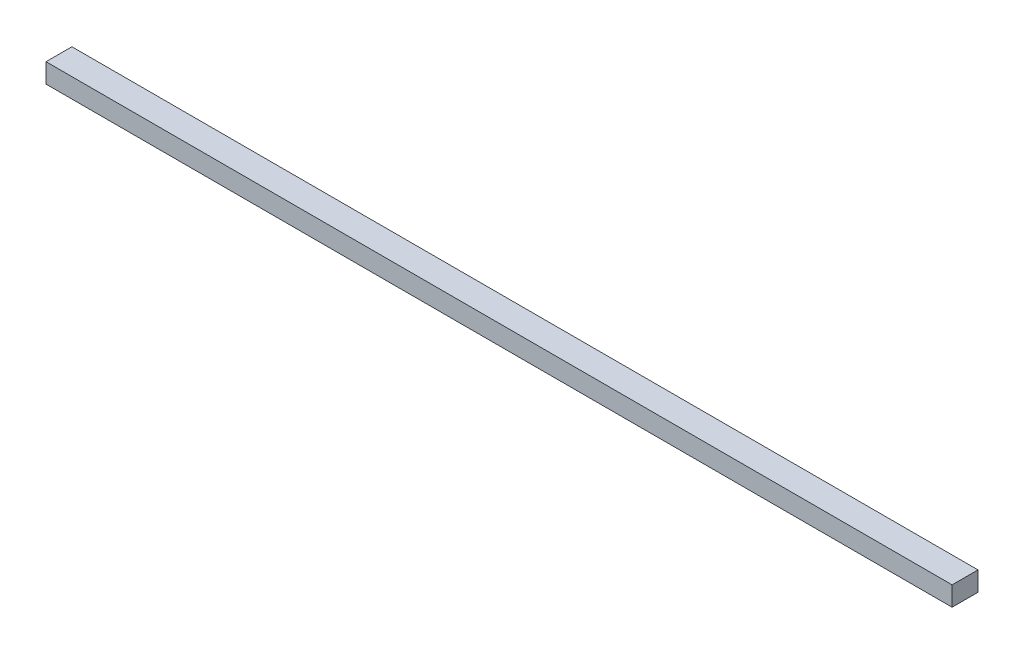
ISO-10303-21;
HEADER;
FILE_DESCRIPTION(('STEP AP214'),'2;1');
FILE_NAME('part.step','',(''),(''),'','','');
FILE_SCHEMA(('AUTOMOTIVE_DESIGN { 1 0 10303 214 1 1 1 1 }'));
ENDSEC;
DATA;
#1=APPLICATION_CONTEXT('core data for automotive mechanical design processes');
#2=APPLICATION_PROTOCOL_DEFINITION('international standard','automotive_design',2000,#1);
#3=PRODUCT_CONTEXT('',#1,'mechanical');
#4=PRODUCT('Part','Part','',(#3));
#5=PRODUCT_RELATED_PRODUCT_CATEGORY('part','',(#4));
#6=PRODUCT_DEFINITION_FORMATION('','',#4);
#7=PRODUCT_DEFINITION_CONTEXT('part definition',#1,'design');
#8=PRODUCT_DEFINITION('design','',#6,#7);
#9=PRODUCT_DEFINITION_SHAPE('','',#8);
#10=(LENGTH_UNIT() NAMED_UNIT(*) SI_UNIT(.MILLI.,.METRE.));
#11=(NAMED_UNIT(*) PLANE_ANGLE_UNIT() SI_UNIT($,.RADIAN.));
#12=(NAMED_UNIT(*) SI_UNIT($,.STERADIAN.) SOLID_ANGLE_UNIT());
#13=UNCERTAINTY_MEASURE_WITH_UNIT(LENGTH_MEASURE(1.E-05),#10,'distance_accuracy_value','');
#14=(GEOMETRIC_REPRESENTATION_CONTEXT(3) GLOBAL_UNCERTAINTY_ASSIGNED_CONTEXT((#13)) GLOBAL_UNIT_ASSIGNED_CONTEXT((#10,
#11,#12)) REPRESENTATION_CONTEXT('',''));
#15=CARTESIAN_POINT('',(0.,0.,0.));
#16=DIRECTION('',(0.,0.,1.));
#17=DIRECTION('',(1.,0.,0.));
#18=AXIS2_PLACEMENT_3D('',#15,#16,#17);
#19=CARTESIAN_POINT('',(140.,6.,4.));
#20=DIRECTION('',(-1.,0.,0.));
#21=DIRECTION('',(0.,0.,1.));
#22=AXIS2_PLACEMENT_3D('',#19,#20,#21);
#23=PLANE('',#22);
#24=DIRECTION('',(0.,0.,-1.));
#25=VECTOR('',#24,1.);
#26=CARTESIAN_POINT('',(140.,0.,4.));
#27=LINE('',#26,#25);
#28=CARTESIAN_POINT('',(140.,0.,4.));
#29=VERTEX_POINT('',#28);
#30=CARTESIAN_POINT('',(140.,0.,-4.));
#31=VERTEX_POINT('',#30);
#32=EDGE_CURVE('E100',#29,#31,#27,.T.);
#33=ORIENTED_EDGE('',*,*,#32,.T.);
#34=DIRECTION('',(0.,-1.,0.));
#35=VECTOR('',#34,1.);
#36=CARTESIAN_POINT('',(140.,6.,-4.));
#37=LINE('',#36,#35);
#38=CARTESIAN_POINT('',(140.,6.,-4.));
#39=VERTEX_POINT('',#38);
#40=EDGE_CURVE('E11',#39,#31,#37,.T.);
#41=ORIENTED_EDGE('',*,*,#40,.F.);
#42=DIRECTION('',(0.,0.,-1.));
#43=VECTOR('',#42,1.);
#44=CARTESIAN_POINT('',(140.,6.,4.));
#45=LINE('',#44,#43);
#46=CARTESIAN_POINT('',(140.,6.,4.));
#47=VERTEX_POINT('',#46);
#48=EDGE_CURVE('E88',#47,#39,#45,.T.);
#49=ORIENTED_EDGE('',*,*,#48,.F.);
#50=DIRECTION('',(0.,-1.,0.));
#51=VECTOR('',#50,1.);
#52=CARTESIAN_POINT('',(140.,6.,4.));
#53=LINE('',#52,#51);
#54=EDGE_CURVE('E96',#47,#29,#53,.T.);
#55=ORIENTED_EDGE('',*,*,#54,.T.);
#56=EDGE_LOOP('',(#33,#41,#49,#55));
#57=FACE_BOUND('',#56,.T.);
#58=ADVANCED_FACE('F37',(#57),#23,.F.);
#59=CARTESIAN_POINT('',(-140.,6.,-4.));
#60=DIRECTION('',(0.,0.,1.));
#61=DIRECTION('',(1.,0.,0.));
#62=AXIS2_PLACEMENT_3D('',#59,#60,#61);
#63=PLANE('',#62);
#64=DIRECTION('',(-1.,0.,0.));
#65=VECTOR('',#64,1.);
#66=CARTESIAN_POINT('',(-140.,0.,-4.));
#67=LINE('',#66,#65);
#68=CARTESIAN_POINT('',(-140.,0.,-4.));
#69=VERTEX_POINT('',#68);
#70=EDGE_CURVE('E92',#31,#69,#67,.T.);
#71=ORIENTED_EDGE('',*,*,#70,.T.);
#72=DIRECTION('',(0.,-1.,0.));
#73=VECTOR('',#72,1.);
#74=CARTESIAN_POINT('',(-140.,6.,-4.));
#75=LINE('',#74,#73);
#76=CARTESIAN_POINT('',(-140.,6.,-4.));
#77=VERTEX_POINT('',#76);
#78=EDGE_CURVE('E45',#77,#69,#75,.T.);
#79=ORIENTED_EDGE('',*,*,#78,.F.);
#80=DIRECTION('',(-1.,0.,0.));
#81=VECTOR('',#80,1.);
#82=CARTESIAN_POINT('',(-140.,6.,-4.));
#83=LINE('',#82,#81);
#84=EDGE_CURVE('E83',#39,#77,#83,.T.);
#85=ORIENTED_EDGE('',*,*,#84,.F.);
#86=ORIENTED_EDGE('',*,*,#40,.T.);
#87=EDGE_LOOP('',(#71,#79,#85,#86));
#88=FACE_BOUND('',#87,.T.);
#89=ADVANCED_FACE('F91',(#88),#63,.F.);
#90=CARTESIAN_POINT('',(-140.,6.,4.));
#91=DIRECTION('',(1.,0.,0.));
#92=DIRECTION('',(0.,0.,-1.));
#93=AXIS2_PLACEMENT_3D('',#90,#91,#92);
#94=PLANE('',#93);
#95=DIRECTION('',(0.,0.,1.));
#96=VECTOR('',#95,1.);
#97=CARTESIAN_POINT('',(-140.,0.,4.));
#98=LINE('',#97,#96);
#99=CARTESIAN_POINT('',(-140.,0.,4.));
#100=VERTEX_POINT('',#99);
#101=EDGE_CURVE('E70',#69,#100,#98,.T.);
#102=ORIENTED_EDGE('',*,*,#101,.T.);
#103=DIRECTION('',(0.,-1.,0.));
#104=VECTOR('',#103,1.);
#105=CARTESIAN_POINT('',(-140.,6.,4.));
#106=LINE('',#105,#104);
#107=CARTESIAN_POINT('',(-140.,6.,4.));
#108=VERTEX_POINT('',#107);
#109=EDGE_CURVE('E93',#108,#100,#106,.T.);
#110=ORIENTED_EDGE('',*,*,#109,.F.);
#111=DIRECTION('',(0.,0.,1.));
#112=VECTOR('',#111,1.);
#113=CARTESIAN_POINT('',(-140.,6.,4.));
#114=LINE('',#113,#112);
#115=EDGE_CURVE('E86',#77,#108,#114,.T.);
#116=ORIENTED_EDGE('',*,*,#115,.F.);
#117=ORIENTED_EDGE('',*,*,#78,.T.);
#118=EDGE_LOOP('',(#102,#110,#116,#117));
#119=FACE_BOUND('',#118,.T.);
#120=ADVANCED_FACE('F94',(#119),#94,.F.);
#121=CARTESIAN_POINT('',(-140.,6.,4.));
#122=DIRECTION('',(0.,0.,-1.));
#123=DIRECTION('',(-1.,0.,0.));
#124=AXIS2_PLACEMENT_3D('',#121,#122,#123);
#125=PLANE('',#124);
#126=DIRECTION('',(1.,0.,0.));
#127=VECTOR('',#126,1.);
#128=CARTESIAN_POINT('',(-140.,0.,4.));
#129=LINE('',#128,#127);
#130=EDGE_CURVE('E76',#100,#29,#129,.T.);
#131=ORIENTED_EDGE('',*,*,#130,.T.);
#132=ORIENTED_EDGE('',*,*,#54,.F.);
#133=DIRECTION('',(1.,0.,0.));
#134=VECTOR('',#133,1.);
#135=CARTESIAN_POINT('',(-140.,6.,4.));
#136=LINE('',#135,#134);
#137=EDGE_CURVE('E53',#108,#47,#136,.T.);
#138=ORIENTED_EDGE('',*,*,#137,.F.);
#139=ORIENTED_EDGE('',*,*,#109,.T.);
#140=EDGE_LOOP('',(#131,#132,#138,#139));
#141=FACE_BOUND('',#140,.T.);
#142=ADVANCED_FACE('F107',(#141),#125,.F.);
#143=CARTESIAN_POINT('',(0.,6.,0.));
#144=DIRECTION('',(0.,-1.,0.));
#145=DIRECTION('',(0.,0.,-1.));
#146=AXIS2_PLACEMENT_3D('',#143,#144,#145);
#147=PLANE('',#146);
#148=ORIENTED_EDGE('',*,*,#48,.T.);
#149=ORIENTED_EDGE('',*,*,#84,.T.);
#150=ORIENTED_EDGE('',*,*,#115,.T.);
#151=ORIENTED_EDGE('',*,*,#137,.T.);
#152=EDGE_LOOP('',(#148,#149,#150,#151));
#153=FACE_BOUND('',#152,.T.);
#154=ADVANCED_FACE('F84',(#153),#147,.F.);
#155=CARTESIAN_POINT('',(0.,0.,0.));
#156=DIRECTION('',(0.,-1.,0.));
#157=DIRECTION('',(0.,0.,-1.));
#158=AXIS2_PLACEMENT_3D('',#155,#156,#157);
#159=PLANE('',#158);
#160=ORIENTED_EDGE('',*,*,#32,.F.);
#161=ORIENTED_EDGE('',*,*,#130,.F.);
#162=ORIENTED_EDGE('',*,*,#101,.F.);
#163=ORIENTED_EDGE('',*,*,#70,.F.);
#164=EDGE_LOOP('',(#160,#161,#162,#163));
#165=FACE_BOUND('',#164,.T.);
#166=ADVANCED_FACE('F110',(#165),#159,.T.);
#167=CLOSED_SHELL('',(#58,#89,#120,#142,#154,#166));
#168=MANIFOLD_SOLID_BREP('B2',#167);
#169=ADVANCED_BREP_SHAPE_REPRESENTATION('',(#18,#168),#14);
#170=SHAPE_DEFINITION_REPRESENTATION(#9,#169);
ENDSEC;
END-ISO-10303-21;
